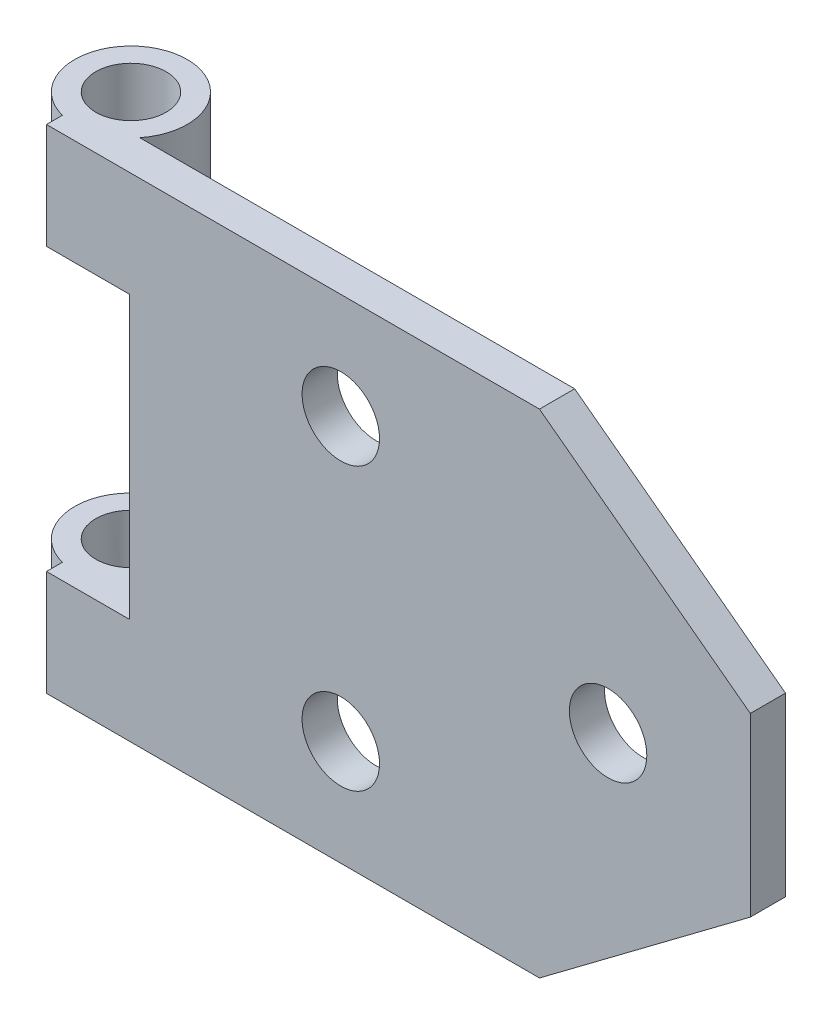
ISO-10303-21;
HEADER;
FILE_DESCRIPTION(('STEP AP214'),'2;1');
FILE_NAME('part.step','',(''),(''),'','','');
FILE_SCHEMA(('AUTOMOTIVE_DESIGN { 1 0 10303 214 1 1 1 1 }'));
ENDSEC;
DATA;
#1=APPLICATION_CONTEXT('core data for automotive mechanical design processes');
#2=APPLICATION_PROTOCOL_DEFINITION('international standard','automotive_design',2000,#1);
#3=PRODUCT_CONTEXT('',#1,'mechanical');
#4=PRODUCT('Part','Part','',(#3));
#5=PRODUCT_RELATED_PRODUCT_CATEGORY('part','',(#4));
#6=PRODUCT_DEFINITION_FORMATION('','',#4);
#7=PRODUCT_DEFINITION_CONTEXT('part definition',#1,'design');
#8=PRODUCT_DEFINITION('design','',#6,#7);
#9=PRODUCT_DEFINITION_SHAPE('','',#8);
#10=(LENGTH_UNIT() NAMED_UNIT(*) SI_UNIT(.MILLI.,.METRE.));
#11=(NAMED_UNIT(*) PLANE_ANGLE_UNIT() SI_UNIT($,.RADIAN.));
#12=(NAMED_UNIT(*) SI_UNIT($,.STERADIAN.) SOLID_ANGLE_UNIT());
#13=UNCERTAINTY_MEASURE_WITH_UNIT(LENGTH_MEASURE(1.E-05),#10,'distance_accuracy_value','');
#14=(GEOMETRIC_REPRESENTATION_CONTEXT(3) GLOBAL_UNCERTAINTY_ASSIGNED_CONTEXT((#13)) GLOBAL_UNIT_ASSIGNED_CONTEXT((#10,
#11,#12)) REPRESENTATION_CONTEXT('',''));
#15=CARTESIAN_POINT('',(0.,0.,0.));
#16=DIRECTION('',(0.,0.,1.));
#17=DIRECTION('',(1.,0.,0.));
#18=AXIS2_PLACEMENT_3D('',#15,#16,#17);
#19=CARTESIAN_POINT('',(2.,70.,-5.));
#20=DIRECTION('',(0.,-1.,0.));
#21=DIRECTION('',(0.,0.,-1.));
#22=AXIS2_PLACEMENT_3D('',#19,#20,#21);
#23=CYLINDRICAL_SURFACE('',#22,8.);
#24=CARTESIAN_POINT('',(2.,55.,-5.));
#25=DIRECTION('',(0.,1.,0.));
#26=DIRECTION('',(0.,0.,1.));
#27=AXIS2_PLACEMENT_3D('',#24,#25,#26);
#28=CIRCLE('',#27,8.);
#29=CARTESIAN_POINT('',(8.24499799839841,55.,0.));
#30=VERTEX_POINT('',#29);
#31=CARTESIAN_POINT('',(0.,55.,2.74596669241484));
#32=VERTEX_POINT('',#31);
#33=EDGE_CURVE('E299',#30,#32,#28,.T.);
#34=ORIENTED_EDGE('',*,*,#33,.T.);
#35=DIRECTION('',(0.,-1.,0.));
#36=VECTOR('',#35,1.);
#37=CARTESIAN_POINT('',(0.,70.,2.74596669241484));
#38=LINE('',#37,#36);
#39=CARTESIAN_POINT('',(0.,70.,2.74596669241484));
#40=VERTEX_POINT('',#39);
#41=EDGE_CURVE('E177',#32,#40,#38,.F.);
#42=ORIENTED_EDGE('',*,*,#41,.T.);
#43=CARTESIAN_POINT('',(2.,70.,-5.));
#44=DIRECTION('',(0.,1.,0.));
#45=DIRECTION('',(0.,0.,1.));
#46=AXIS2_PLACEMENT_3D('',#43,#44,#45);
#47=CIRCLE('',#46,8.);
#48=CARTESIAN_POINT('',(8.24499799839841,70.,0.));
#49=VERTEX_POINT('',#48);
#50=EDGE_CURVE('E163',#49,#40,#47,.T.);
#51=ORIENTED_EDGE('',*,*,#50,.F.);
#52=DIRECTION('',(0.,-1.,0.));
#53=VECTOR('',#52,1.);
#54=CARTESIAN_POINT('',(8.24499799839841,70.,0.));
#55=LINE('',#54,#53);
#56=EDGE_CURVE('E64',#30,#49,#55,.F.);
#57=ORIENTED_EDGE('',*,*,#56,.F.);
#58=EDGE_LOOP('',(#34,#42,#51,#57));
#59=FACE_BOUND('',#58,.T.);
#60=ADVANCED_FACE('F39',(#59),#23,.T.);
#61=CARTESIAN_POINT('',(2.,70.,-5.));
#62=DIRECTION('',(0.,-1.,0.));
#63=DIRECTION('',(0.,0.,-1.));
#64=AXIS2_PLACEMENT_3D('',#61,#62,#63);
#65=CYLINDRICAL_SURFACE('',#64,5.);
#66=CARTESIAN_POINT('',(2.,55.,-5.));
#67=DIRECTION('',(0.,1.,0.));
#68=DIRECTION('',(0.,0.,1.));
#69=AXIS2_PLACEMENT_3D('',#66,#67,#68);
#70=CIRCLE('',#69,5.);
#71=CARTESIAN_POINT('',(2.,55.,0.));
#72=VERTEX_POINT('',#71);
#73=EDGE_CURVE('E43',#72,#72,#70,.T.);
#74=ORIENTED_EDGE('',*,*,#73,.F.);
#75=EDGE_LOOP('',(#74));
#76=FACE_BOUND('',#75,.T.);
#77=CARTESIAN_POINT('',(2.,70.,-5.));
#78=DIRECTION('',(0.,1.,0.));
#79=DIRECTION('',(0.,0.,1.));
#80=AXIS2_PLACEMENT_3D('',#77,#78,#79);
#81=CIRCLE('',#80,5.);
#82=CARTESIAN_POINT('',(2.,70.,0.));
#83=VERTEX_POINT('',#82);
#84=EDGE_CURVE('E164',#83,#83,#81,.T.);
#85=ORIENTED_EDGE('',*,*,#84,.T.);
#86=EDGE_LOOP('',(#85));
#87=FACE_BOUND('',#86,.T.);
#88=ADVANCED_FACE('F294',(#76,#87),#65,.F.);
#89=CARTESIAN_POINT('',(0.,0.,0.));
#90=DIRECTION('',(0.,0.,-1.));
#91=DIRECTION('',(-1.,0.,0.));
#92=AXIS2_PLACEMENT_3D('',#89,#90,#91);
#93=PLANE('',#92);
#94=CARTESIAN_POINT('',(41.8149779691345,15.,0.));
#95=DIRECTION('',(0.,0.,1.));
#96=DIRECTION('',(1.,0.,0.));
#97=AXIS2_PLACEMENT_3D('',#94,#95,#96);
#98=CIRCLE('',#97,5.50117827448801);
#99=CARTESIAN_POINT('',(47.3161562436225,15.,0.));
#100=VERTEX_POINT('',#99);
#101=EDGE_CURVE('E185',#100,#100,#98,.T.);
#102=ORIENTED_EDGE('',*,*,#101,.T.);
#103=EDGE_LOOP('',(#102));
#104=FACE_BOUND('',#103,.T.);
#105=CARTESIAN_POINT('',(41.8149779691345,55.,0.));
#106=DIRECTION('',(0.,0.,1.));
#107=DIRECTION('',(1.,0.,0.));
#108=AXIS2_PLACEMENT_3D('',#105,#106,#107);
#109=CIRCLE('',#108,5.50117827448801);
#110=CARTESIAN_POINT('',(47.3161562436225,55.,0.));
#111=VERTEX_POINT('',#110);
#112=EDGE_CURVE('E194',#111,#111,#109,.T.);
#113=ORIENTED_EDGE('',*,*,#112,.T.);
#114=EDGE_LOOP('',(#113));
#115=FACE_BOUND('',#114,.T.);
#116=CARTESIAN_POINT('',(79.7899634060271,35.,0.));
#117=DIRECTION('',(0.,0.,1.));
#118=DIRECTION('',(1.,0.,0.));
#119=AXIS2_PLACEMENT_3D('',#116,#117,#118);
#120=CIRCLE('',#119,5.50117827448801);
#121=CARTESIAN_POINT('',(85.2911416805151,35.,0.));
#122=VERTEX_POINT('',#121);
#123=EDGE_CURVE('E186',#122,#122,#120,.T.);
#124=ORIENTED_EDGE('',*,*,#123,.T.);
#125=EDGE_LOOP('',(#124));
#126=FACE_BOUND('',#125,.T.);
#127=DIRECTION('',(1.,0.,0.));
#128=VECTOR('',#127,1.);
#129=CARTESIAN_POINT('',(70.0435705663086,0.,0.));
#130=LINE('',#129,#128);
#131=CARTESIAN_POINT('',(8.24499799839841,0.,0.));
#132=VERTEX_POINT('',#131);
#133=CARTESIAN_POINT('',(70.0435705663086,0.,0.));
#134=VERTEX_POINT('',#133);
#135=EDGE_CURVE('E57',#132,#134,#130,.T.);
#136=ORIENTED_EDGE('',*,*,#135,.F.);
#137=CARTESIAN_POINT('',(8.24499799839841,15.,0.));
#138=VERTEX_POINT('',#137);
#139=EDGE_CURVE('E160',#132,#138,#55,.F.);
#140=ORIENTED_EDGE('',*,*,#139,.T.);
#141=DIRECTION('',(-1.,0.,0.));
#142=VECTOR('',#141,1.);
#143=CARTESIAN_POINT('',(0.,15.,0.));
#144=LINE('',#143,#142);
#145=CARTESIAN_POINT('',(11.823798536108,15.,0.));
#146=VERTEX_POINT('',#145);
#147=EDGE_CURVE('E142',#146,#138,#144,.T.);
#148=ORIENTED_EDGE('',*,*,#147,.F.);
#149=DIRECTION('',(0.,-1.,0.));
#150=VECTOR('',#149,1.);
#151=CARTESIAN_POINT('',(11.823798536108,15.,0.));
#152=LINE('',#151,#150);
#153=CARTESIAN_POINT('',(11.823798536108,55.,0.));
#154=VERTEX_POINT('',#153);
#155=EDGE_CURVE('E252',#154,#146,#152,.T.);
#156=ORIENTED_EDGE('',*,*,#155,.F.);
#157=DIRECTION('',(1.,0.,0.));
#158=VECTOR('',#157,1.);
#159=CARTESIAN_POINT('',(11.823798536108,55.,0.));
#160=LINE('',#159,#158);
#161=EDGE_CURVE('E249',#30,#154,#160,.T.);
#162=ORIENTED_EDGE('',*,*,#161,.F.);
#163=ORIENTED_EDGE('',*,*,#56,.T.);
#164=DIRECTION('',(-1.,0.,0.));
#165=VECTOR('',#164,1.);
#166=CARTESIAN_POINT('',(0.,70.,0.));
#167=LINE('',#166,#165);
#168=CARTESIAN_POINT('',(70.0435705663086,70.,0.));
#169=VERTEX_POINT('',#168);
#170=EDGE_CURVE('E246',#169,#49,#167,.T.);
#171=ORIENTED_EDGE('',*,*,#170,.F.);
#172=DIRECTION('',(-0.8,0.6,0.));
#173=VECTOR('',#172,1.);
#174=CARTESIAN_POINT('',(70.0435705663086,70.,0.));
#175=LINE('',#174,#173);
#176=CARTESIAN_POINT('',(100.,47.5326779247315,0.));
#177=VERTEX_POINT('',#176);
#178=EDGE_CURVE('E243',#177,#169,#175,.T.);
#179=ORIENTED_EDGE('',*,*,#178,.F.);
#180=DIRECTION('',(0.,1.,0.));
#181=VECTOR('',#180,1.);
#182=CARTESIAN_POINT('',(100.,47.5326779247315,0.));
#183=LINE('',#182,#181);
#184=CARTESIAN_POINT('',(100.,22.4673220752685,0.));
#185=VERTEX_POINT('',#184);
#186=EDGE_CURVE('E240',#185,#177,#183,.T.);
#187=ORIENTED_EDGE('',*,*,#186,.F.);
#188=DIRECTION('',(0.8,0.6,0.));
#189=VECTOR('',#188,1.);
#190=CARTESIAN_POINT('',(100.,22.4673220752685,0.));
#191=LINE('',#190,#189);
#192=EDGE_CURVE('E237',#134,#185,#191,.T.);
#193=ORIENTED_EDGE('',*,*,#192,.F.);
#194=EDGE_LOOP('',(#136,#140,#148,#156,#162,#163,#171,#179,#187,#193));
#195=FACE_BOUND('',#194,.T.);
#196=ADVANCED_FACE('F311',(#104,#115,#126,#195),#93,.T.);
#197=CARTESIAN_POINT('',(0.,55.,5.));
#198=DIRECTION('',(1.,0.,0.));
#199=DIRECTION('',(0.,0.,-1.));
#200=AXIS2_PLACEMENT_3D('',#197,#198,#199);
#201=PLANE('',#200);
#202=ORIENTED_EDGE('',*,*,#41,.F.);
#203=DIRECTION('',(0.,0.,-1.));
#204=VECTOR('',#203,1.);
#205=CARTESIAN_POINT('',(0.,55.,5.));
#206=LINE('',#205,#204);
#207=CARTESIAN_POINT('',(0.,55.,5.));
#208=VERTEX_POINT('',#207);
#209=EDGE_CURVE('E265',#208,#32,#206,.T.);
#210=ORIENTED_EDGE('',*,*,#209,.F.);
#211=DIRECTION('',(0.,-1.,0.));
#212=VECTOR('',#211,1.);
#213=CARTESIAN_POINT('',(0.,55.,5.));
#214=LINE('',#213,#212);
#215=CARTESIAN_POINT('',(0.,70.,5.));
#216=VERTEX_POINT('',#215);
#217=EDGE_CURVE('E221',#216,#208,#214,.T.);
#218=ORIENTED_EDGE('',*,*,#217,.F.);
#219=DIRECTION('',(0.,0.,-1.));
#220=VECTOR('',#219,1.);
#221=CARTESIAN_POINT('',(0.,70.,5.));
#222=LINE('',#221,#220);
#223=EDGE_CURVE('E269',#216,#40,#222,.T.);
#224=ORIENTED_EDGE('',*,*,#223,.T.);
#225=EDGE_LOOP('',(#202,#210,#218,#224));
#226=FACE_BOUND('',#225,.T.);
#227=ADVANCED_FACE('F327',(#226),#201,.F.);
#228=CARTESIAN_POINT('',(0.,0.,5.));
#229=DIRECTION('',(1.,0.,0.));
#230=DIRECTION('',(0.,0.,-1.));
#231=AXIS2_PLACEMENT_3D('',#228,#229,#230);
#232=PLANE('',#231);
#233=DIRECTION('',(0.,-1.,0.));
#234=VECTOR('',#233,1.);
#235=CARTESIAN_POINT('',(0.,70.,2.74596669241484));
#236=LINE('',#235,#234);
#237=CARTESIAN_POINT('',(0.,0.,2.74596669241484));
#238=VERTEX_POINT('',#237);
#239=CARTESIAN_POINT('',(0.,15.,2.74596669241484));
#240=VERTEX_POINT('',#239);
#241=EDGE_CURVE('E11',#238,#240,#236,.F.);
#242=ORIENTED_EDGE('',*,*,#241,.F.);
#243=DIRECTION('',(0.,0.,-1.));
#244=VECTOR('',#243,1.);
#245=CARTESIAN_POINT('',(0.,0.,5.));
#246=LINE('',#245,#244);
#247=CARTESIAN_POINT('',(0.,0.,5.));
#248=VERTEX_POINT('',#247);
#249=EDGE_CURVE('E154',#248,#238,#246,.T.);
#250=ORIENTED_EDGE('',*,*,#249,.F.);
#251=DIRECTION('',(0.,-1.,0.));
#252=VECTOR('',#251,1.);
#253=CARTESIAN_POINT('',(0.,0.,5.));
#254=LINE('',#253,#252);
#255=CARTESIAN_POINT('',(0.,15.,5.));
#256=VERTEX_POINT('',#255);
#257=EDGE_CURVE('E151',#256,#248,#254,.T.);
#258=ORIENTED_EDGE('',*,*,#257,.F.);
#259=DIRECTION('',(0.,0.,-1.));
#260=VECTOR('',#259,1.);
#261=CARTESIAN_POINT('',(0.,15.,5.));
#262=LINE('',#261,#260);
#263=EDGE_CURVE('E138',#256,#240,#262,.T.);
#264=ORIENTED_EDGE('',*,*,#263,.T.);
#265=EDGE_LOOP('',(#242,#250,#258,#264));
#266=FACE_BOUND('',#265,.T.);
#267=ADVANCED_FACE('F148',(#266),#232,.F.);
#268=CARTESIAN_POINT('',(0.,0.,5.));
#269=DIRECTION('',(0.,0.,-1.));
#270=DIRECTION('',(-1.,0.,0.));
#271=AXIS2_PLACEMENT_3D('',#268,#269,#270);
#272=PLANE('',#271);
#273=DIRECTION('',(1.,0.,0.));
#274=VECTOR('',#273,1.);
#275=CARTESIAN_POINT('',(70.0435705663086,0.,5.));
#276=LINE('',#275,#274);
#277=CARTESIAN_POINT('',(70.0435705663086,0.,5.));
#278=VERTEX_POINT('',#277);
#279=EDGE_CURVE('E205',#248,#278,#276,.T.);
#280=ORIENTED_EDGE('',*,*,#279,.T.);
#281=DIRECTION('',(0.8,0.6,0.));
#282=VECTOR('',#281,1.);
#283=CARTESIAN_POINT('',(100.,22.4673220752685,5.));
#284=LINE('',#283,#282);
#285=CARTESIAN_POINT('',(100.,22.4673220752685,5.));
#286=VERTEX_POINT('',#285);
#287=EDGE_CURVE('E209',#278,#286,#284,.T.);
#288=ORIENTED_EDGE('',*,*,#287,.T.);
#289=DIRECTION('',(0.,1.,0.));
#290=VECTOR('',#289,1.);
#291=CARTESIAN_POINT('',(100.,47.5326779247315,5.));
#292=LINE('',#291,#290);
#293=CARTESIAN_POINT('',(100.,47.5326779247315,5.));
#294=VERTEX_POINT('',#293);
#295=EDGE_CURVE('E212',#286,#294,#292,.T.);
#296=ORIENTED_EDGE('',*,*,#295,.T.);
#297=DIRECTION('',(-0.8,0.6,0.));
#298=VECTOR('',#297,1.);
#299=CARTESIAN_POINT('',(70.0435705663086,70.,5.));
#300=LINE('',#299,#298);
#301=CARTESIAN_POINT('',(70.0435705663086,70.,5.));
#302=VERTEX_POINT('',#301);
#303=EDGE_CURVE('E215',#294,#302,#300,.T.);
#304=ORIENTED_EDGE('',*,*,#303,.T.);
#305=DIRECTION('',(-1.,0.,0.));
#306=VECTOR('',#305,1.);
#307=CARTESIAN_POINT('',(0.,70.,5.));
#308=LINE('',#307,#306);
#309=EDGE_CURVE('E218',#302,#216,#308,.T.);
#310=ORIENTED_EDGE('',*,*,#309,.T.);
#311=ORIENTED_EDGE('',*,*,#217,.T.);
#312=DIRECTION('',(1.,0.,0.));
#313=VECTOR('',#312,1.);
#314=CARTESIAN_POINT('',(11.823798536108,55.,5.));
#315=LINE('',#314,#313);
#316=CARTESIAN_POINT('',(11.823798536108,55.,5.));
#317=VERTEX_POINT('',#316);
#318=EDGE_CURVE('E224',#208,#317,#315,.T.);
#319=ORIENTED_EDGE('',*,*,#318,.T.);
#320=DIRECTION('',(0.,-1.,0.));
#321=VECTOR('',#320,1.);
#322=CARTESIAN_POINT('',(11.823798536108,15.,5.));
#323=LINE('',#322,#321);
#324=CARTESIAN_POINT('',(11.823798536108,15.,5.));
#325=VERTEX_POINT('',#324);
#326=EDGE_CURVE('E227',#317,#325,#323,.T.);
#327=ORIENTED_EDGE('',*,*,#326,.T.);
#328=DIRECTION('',(-1.,0.,0.));
#329=VECTOR('',#328,1.);
#330=CARTESIAN_POINT('',(0.,15.,5.));
#331=LINE('',#330,#329);
#332=EDGE_CURVE('E230',#325,#256,#331,.T.);
#333=ORIENTED_EDGE('',*,*,#332,.T.);
#334=ORIENTED_EDGE('',*,*,#257,.T.);
#335=EDGE_LOOP('',(#280,#288,#296,#304,#310,#311,#319,#327,#333,#334));
#336=FACE_BOUND('',#335,.T.);
#337=CARTESIAN_POINT('',(41.8149779691345,55.,5.));
#338=DIRECTION('',(0.,0.,1.));
#339=DIRECTION('',(1.,0.,0.));
#340=AXIS2_PLACEMENT_3D('',#337,#338,#339);
#341=CIRCLE('',#340,5.50117827448801);
#342=CARTESIAN_POINT('',(47.3161562436225,55.,5.));
#343=VERTEX_POINT('',#342);
#344=EDGE_CURVE('E198',#343,#343,#341,.T.);
#345=ORIENTED_EDGE('',*,*,#344,.F.);
#346=EDGE_LOOP('',(#345));
#347=FACE_BOUND('',#346,.T.);
#348=CARTESIAN_POINT('',(41.8149779691345,15.,5.));
#349=DIRECTION('',(0.,0.,1.));
#350=DIRECTION('',(1.,0.,0.));
#351=AXIS2_PLACEMENT_3D('',#348,#349,#350);
#352=CIRCLE('',#351,5.50117827448801);
#353=CARTESIAN_POINT('',(47.3161562436225,15.,5.));
#354=VERTEX_POINT('',#353);
#355=EDGE_CURVE('E190',#354,#354,#352,.T.);
#356=ORIENTED_EDGE('',*,*,#355,.F.);
#357=EDGE_LOOP('',(#356));
#358=FACE_BOUND('',#357,.T.);
#359=CARTESIAN_POINT('',(79.7899634060271,35.,5.));
#360=DIRECTION('',(0.,0.,1.));
#361=DIRECTION('',(1.,0.,0.));
#362=AXIS2_PLACEMENT_3D('',#359,#360,#361);
#363=CIRCLE('',#362,5.50117827448801);
#364=CARTESIAN_POINT('',(85.2911416805151,35.,5.));
#365=VERTEX_POINT('',#364);
#366=EDGE_CURVE('E181',#365,#365,#363,.T.);
#367=ORIENTED_EDGE('',*,*,#366,.F.);
#368=EDGE_LOOP('',(#367));
#369=FACE_BOUND('',#368,.T.);
#370=ADVANCED_FACE('F331',(#336,#347,#358,#369),#272,.F.);
#371=CARTESIAN_POINT('',(70.0435705663086,0.,5.));
#372=DIRECTION('',(0.,1.,0.));
#373=DIRECTION('',(-1.,0.,0.));
#374=AXIS2_PLACEMENT_3D('',#371,#372,#373);
#375=PLANE('',#374);
#376=CARTESIAN_POINT('',(2.,0.,-5.));
#377=DIRECTION('',(0.,1.,0.));
#378=DIRECTION('',(0.,0.,1.));
#379=AXIS2_PLACEMENT_3D('',#376,#377,#378);
#380=CIRCLE('',#379,5.);
#381=CARTESIAN_POINT('',(2.,0.,0.));
#382=VERTEX_POINT('',#381);
#383=EDGE_CURVE('E171',#382,#382,#380,.T.);
#384=ORIENTED_EDGE('',*,*,#383,.T.);
#385=EDGE_LOOP('',(#384));
#386=FACE_BOUND('',#385,.T.);
#387=CARTESIAN_POINT('',(2.,0.,-5.));
#388=DIRECTION('',(0.,1.,0.));
#389=DIRECTION('',(0.,0.,1.));
#390=AXIS2_PLACEMENT_3D('',#387,#388,#389);
#391=CIRCLE('',#390,8.);
#392=EDGE_CURVE('E159',#132,#238,#391,.T.);
#393=ORIENTED_EDGE('',*,*,#392,.F.);
#394=ORIENTED_EDGE('',*,*,#135,.T.);
#395=DIRECTION('',(0.,0.,-1.));
#396=VECTOR('',#395,1.);
#397=CARTESIAN_POINT('',(70.0435705663086,0.,5.));
#398=LINE('',#397,#396);
#399=EDGE_CURVE('E49',#278,#134,#398,.T.);
#400=ORIENTED_EDGE('',*,*,#399,.F.);
#401=ORIENTED_EDGE('',*,*,#279,.F.);
#402=ORIENTED_EDGE('',*,*,#249,.T.);
#403=EDGE_LOOP('',(#393,#394,#400,#401,#402));
#404=FACE_BOUND('',#403,.T.);
#405=ADVANCED_FACE('F41',(#386,#404),#375,.F.);
#406=CARTESIAN_POINT('',(100.,22.4673220752685,5.));
#407=DIRECTION('',(-0.6,0.8,0.));
#408=DIRECTION('',(-0.8,-0.6,0.));
#409=AXIS2_PLACEMENT_3D('',#406,#407,#408);
#410=PLANE('',#409);
#411=ORIENTED_EDGE('',*,*,#192,.T.);
#412=DIRECTION('',(0.,0.,-1.));
#413=VECTOR('',#412,1.);
#414=CARTESIAN_POINT('',(100.,22.4673220752685,5.));
#415=LINE('',#414,#413);
#416=EDGE_CURVE('E280',#286,#185,#415,.T.);
#417=ORIENTED_EDGE('',*,*,#416,.F.);
#418=ORIENTED_EDGE('',*,*,#287,.F.);
#419=ORIENTED_EDGE('',*,*,#399,.T.);
#420=EDGE_LOOP('',(#411,#417,#418,#419));
#421=FACE_BOUND('',#420,.T.);
#422=ADVANCED_FACE('F342',(#421),#410,.F.);
#423=CARTESIAN_POINT('',(100.,47.5326779247315,5.));
#424=DIRECTION('',(-1.,0.,0.));
#425=DIRECTION('',(0.,0.,1.));
#426=AXIS2_PLACEMENT_3D('',#423,#424,#425);
#427=PLANE('',#426);
#428=ORIENTED_EDGE('',*,*,#186,.T.);
#429=DIRECTION('',(0.,0.,-1.));
#430=VECTOR('',#429,1.);
#431=CARTESIAN_POINT('',(100.,47.5326779247315,5.));
#432=LINE('',#431,#430);
#433=EDGE_CURVE('E276',#294,#177,#432,.T.);
#434=ORIENTED_EDGE('',*,*,#433,.F.);
#435=ORIENTED_EDGE('',*,*,#295,.F.);
#436=ORIENTED_EDGE('',*,*,#416,.T.);
#437=EDGE_LOOP('',(#428,#434,#435,#436));
#438=FACE_BOUND('',#437,.T.);
#439=ADVANCED_FACE('F339',(#438),#427,.F.);
#440=CARTESIAN_POINT('',(70.0435705663086,70.,5.));
#441=DIRECTION('',(-0.6,-0.8,0.));
#442=DIRECTION('',(0.8,-0.6,0.));
#443=AXIS2_PLACEMENT_3D('',#440,#441,#442);
#444=PLANE('',#443);
#445=ORIENTED_EDGE('',*,*,#178,.T.);
#446=DIRECTION('',(0.,0.,-1.));
#447=VECTOR('',#446,1.);
#448=CARTESIAN_POINT('',(70.0435705663086,70.,5.));
#449=LINE('',#448,#447);
#450=EDGE_CURVE('E272',#302,#169,#449,.T.);
#451=ORIENTED_EDGE('',*,*,#450,.F.);
#452=ORIENTED_EDGE('',*,*,#303,.F.);
#453=ORIENTED_EDGE('',*,*,#433,.T.);
#454=EDGE_LOOP('',(#445,#451,#452,#453));
#455=FACE_BOUND('',#454,.T.);
#456=ADVANCED_FACE('F317',(#455),#444,.F.);
#457=CARTESIAN_POINT('',(0.,70.,5.));
#458=DIRECTION('',(0.,-1.,0.));
#459=DIRECTION('',(1.,0.,0.));
#460=AXIS2_PLACEMENT_3D('',#457,#458,#459);
#461=PLANE('',#460);
#462=ORIENTED_EDGE('',*,*,#84,.F.);
#463=EDGE_LOOP('',(#462));
#464=FACE_BOUND('',#463,.T.);
#465=ORIENTED_EDGE('',*,*,#170,.T.);
#466=ORIENTED_EDGE('',*,*,#50,.T.);
#467=ORIENTED_EDGE('',*,*,#223,.F.);
#468=ORIENTED_EDGE('',*,*,#309,.F.);
#469=ORIENTED_EDGE('',*,*,#450,.T.);
#470=EDGE_LOOP('',(#465,#466,#467,#468,#469));
#471=FACE_BOUND('',#470,.T.);
#472=ADVANCED_FACE('F314',(#464,#471),#461,.F.);
#473=CARTESIAN_POINT('',(11.823798536108,55.,5.));
#474=DIRECTION('',(0.,1.,0.));
#475=DIRECTION('',(0.,0.,1.));
#476=AXIS2_PLACEMENT_3D('',#473,#474,#475);
#477=PLANE('',#476);
#478=ORIENTED_EDGE('',*,*,#209,.T.);
#479=ORIENTED_EDGE('',*,*,#33,.F.);
#480=ORIENTED_EDGE('',*,*,#161,.T.);
#481=DIRECTION('',(0.,0.,-1.));
#482=VECTOR('',#481,1.);
#483=CARTESIAN_POINT('',(11.823798536108,55.,5.));
#484=LINE('',#483,#482);
#485=EDGE_CURVE('E261',#317,#154,#484,.T.);
#486=ORIENTED_EDGE('',*,*,#485,.F.);
#487=ORIENTED_EDGE('',*,*,#318,.F.);
#488=EDGE_LOOP('',(#478,#479,#480,#486,#487));
#489=FACE_BOUND('',#488,.T.);
#490=ORIENTED_EDGE('',*,*,#73,.T.);
#491=EDGE_LOOP('',(#490));
#492=FACE_BOUND('',#491,.T.);
#493=ADVANCED_FACE('F307',(#489,#492),#477,.F.);
#494=CARTESIAN_POINT('',(11.823798536108,15.,5.));
#495=DIRECTION('',(1.,0.,0.));
#496=DIRECTION('',(0.,0.,-1.));
#497=AXIS2_PLACEMENT_3D('',#494,#495,#496);
#498=PLANE('',#497);
#499=ORIENTED_EDGE('',*,*,#155,.T.);
#500=DIRECTION('',(0.,0.,-1.));
#501=VECTOR('',#500,1.);
#502=CARTESIAN_POINT('',(11.823798536108,15.,5.));
#503=LINE('',#502,#501);
#504=EDGE_CURVE('E153',#325,#146,#503,.T.);
#505=ORIENTED_EDGE('',*,*,#504,.F.);
#506=ORIENTED_EDGE('',*,*,#326,.F.);
#507=ORIENTED_EDGE('',*,*,#485,.T.);
#508=EDGE_LOOP('',(#499,#505,#506,#507));
#509=FACE_BOUND('',#508,.T.);
#510=ADVANCED_FACE('F349',(#509),#498,.F.);
#511=CARTESIAN_POINT('',(0.,15.,5.));
#512=DIRECTION('',(0.,-1.,0.));
#513=DIRECTION('',(0.,0.,-1.));
#514=AXIS2_PLACEMENT_3D('',#511,#512,#513);
#515=PLANE('',#514);
#516=ORIENTED_EDGE('',*,*,#147,.T.);
#517=CARTESIAN_POINT('',(2.,15.,-5.));
#518=DIRECTION('',(0.,-1.,0.));
#519=DIRECTION('',(1.,0.,0.));
#520=AXIS2_PLACEMENT_3D('',#517,#518,#519);
#521=CIRCLE('',#520,8.);
#522=EDGE_CURVE('E133',#240,#138,#521,.T.);
#523=ORIENTED_EDGE('',*,*,#522,.F.);
#524=ORIENTED_EDGE('',*,*,#263,.F.);
#525=ORIENTED_EDGE('',*,*,#332,.F.);
#526=ORIENTED_EDGE('',*,*,#504,.T.);
#527=EDGE_LOOP('',(#516,#523,#524,#525,#526));
#528=FACE_BOUND('',#527,.T.);
#529=CARTESIAN_POINT('',(2.,15.,-5.));
#530=DIRECTION('',(0.,-1.,0.));
#531=DIRECTION('',(1.,0.,0.));
#532=AXIS2_PLACEMENT_3D('',#529,#530,#531);
#533=CIRCLE('',#532,5.);
#534=CARTESIAN_POINT('',(7.00000000000001,15.,-5.));
#535=VERTEX_POINT('',#534);
#536=EDGE_CURVE('E145',#535,#535,#533,.T.);
#537=ORIENTED_EDGE('',*,*,#536,.T.);
#538=EDGE_LOOP('',(#537));
#539=FACE_BOUND('',#538,.T.);
#540=ADVANCED_FACE('F135',(#528,#539),#515,.F.);
#541=CARTESIAN_POINT('',(41.8149779691345,55.,5.));
#542=DIRECTION('',(0.,0.,-1.));
#543=DIRECTION('',(-1.,0.,0.));
#544=AXIS2_PLACEMENT_3D('',#541,#542,#543);
#545=CYLINDRICAL_SURFACE('',#544,5.50117827448801);
#546=ORIENTED_EDGE('',*,*,#344,.T.);
#547=EDGE_LOOP('',(#546));
#548=FACE_BOUND('',#547,.T.);
#549=ORIENTED_EDGE('',*,*,#112,.F.);
#550=EDGE_LOOP('',(#549));
#551=FACE_BOUND('',#550,.T.);
#552=ADVANCED_FACE('F374',(#548,#551),#545,.F.);
#553=CARTESIAN_POINT('',(41.8149779691345,15.,5.));
#554=DIRECTION('',(0.,0.,-1.));
#555=DIRECTION('',(-1.,0.,0.));
#556=AXIS2_PLACEMENT_3D('',#553,#554,#555);
#557=CYLINDRICAL_SURFACE('',#556,5.50117827448801);
#558=ORIENTED_EDGE('',*,*,#355,.T.);
#559=EDGE_LOOP('',(#558));
#560=FACE_BOUND('',#559,.T.);
#561=ORIENTED_EDGE('',*,*,#101,.F.);
#562=EDGE_LOOP('',(#561));
#563=FACE_BOUND('',#562,.T.);
#564=ADVANCED_FACE('F369',(#560,#563),#557,.F.);
#565=CARTESIAN_POINT('',(79.7899634060271,35.,5.));
#566=DIRECTION('',(0.,0.,-1.));
#567=DIRECTION('',(-1.,0.,0.));
#568=AXIS2_PLACEMENT_3D('',#565,#566,#567);
#569=CYLINDRICAL_SURFACE('',#568,5.50117827448801);
#570=ORIENTED_EDGE('',*,*,#366,.T.);
#571=EDGE_LOOP('',(#570));
#572=FACE_BOUND('',#571,.T.);
#573=ORIENTED_EDGE('',*,*,#123,.F.);
#574=EDGE_LOOP('',(#573));
#575=FACE_BOUND('',#574,.T.);
#576=ADVANCED_FACE('F365',(#572,#575),#569,.F.);
#577=ORIENTED_EDGE('',*,*,#241,.T.);
#578=ORIENTED_EDGE('',*,*,#522,.T.);
#579=ORIENTED_EDGE('',*,*,#139,.F.);
#580=ORIENTED_EDGE('',*,*,#392,.T.);
#581=EDGE_LOOP('',(#577,#578,#579,#580));
#582=FACE_BOUND('',#581,.T.);
#583=ADVANCED_FACE('F157',(#582),#23,.T.);
#584=ORIENTED_EDGE('',*,*,#536,.F.);
#585=EDGE_LOOP('',(#584));
#586=FACE_BOUND('',#585,.T.);
#587=ORIENTED_EDGE('',*,*,#383,.F.);
#588=EDGE_LOOP('',(#587));
#589=FACE_BOUND('',#588,.T.);
#590=ADVANCED_FACE('F290',(#586,#589),#65,.F.);
#591=CLOSED_SHELL('',(#60,#88,#196,#227,#267,#370,#405,#422,#439,#456,#472,#493,#510,#540,#552,
#564,#576,#583,#590));
#592=MANIFOLD_SOLID_BREP('B2',#591);
#593=ADVANCED_BREP_SHAPE_REPRESENTATION('',(#18,#592),#14);
#594=SHAPE_DEFINITION_REPRESENTATION(#9,#593);
ENDSEC;
END-ISO-10303-21;
